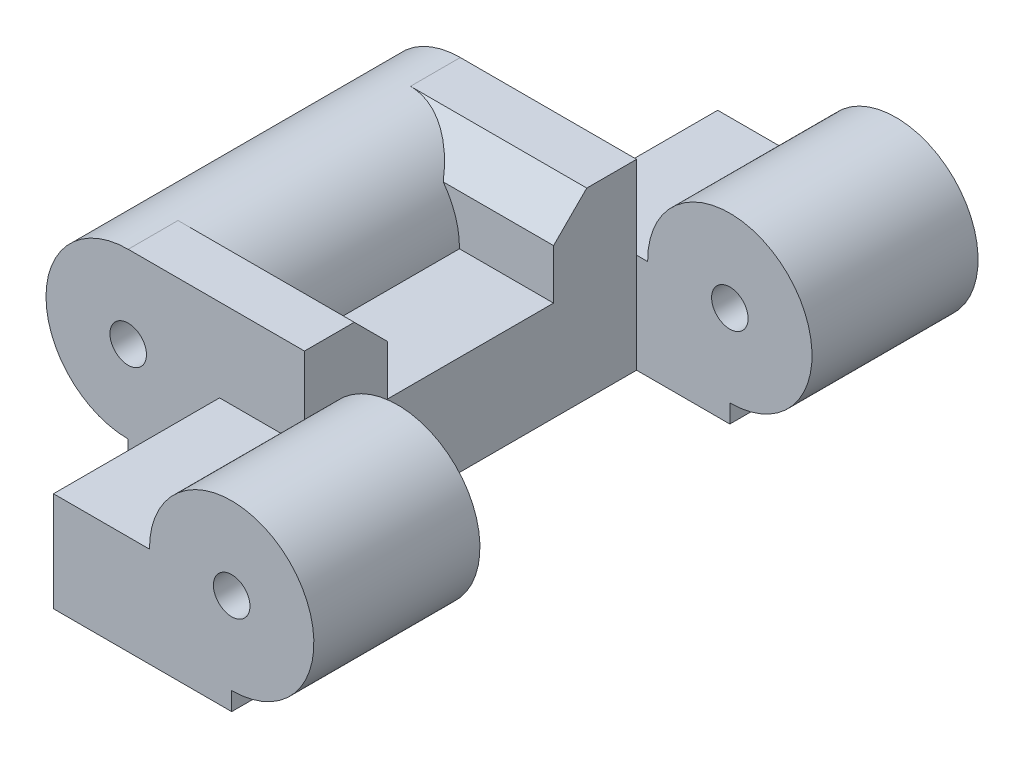
ISO-10303-21;
HEADER;
FILE_DESCRIPTION(('STEP AP214'),'2;1');
FILE_NAME('part.step','',(''),(''),'','','');
FILE_SCHEMA(('AUTOMOTIVE_DESIGN { 1 0 10303 214 1 1 1 1 }'));
ENDSEC;
DATA;
#1=APPLICATION_CONTEXT('core data for automotive mechanical design processes');
#2=APPLICATION_PROTOCOL_DEFINITION('international standard','automotive_design',2000,#1);
#3=PRODUCT_CONTEXT('',#1,'mechanical');
#4=PRODUCT('Part','Part','',(#3));
#5=PRODUCT_RELATED_PRODUCT_CATEGORY('part','',(#4));
#6=PRODUCT_DEFINITION_FORMATION('','',#4);
#7=PRODUCT_DEFINITION_CONTEXT('part definition',#1,'design');
#8=PRODUCT_DEFINITION('design','',#6,#7);
#9=PRODUCT_DEFINITION_SHAPE('','',#8);
#10=(LENGTH_UNIT() NAMED_UNIT(*) SI_UNIT(.MILLI.,.METRE.));
#11=(NAMED_UNIT(*) PLANE_ANGLE_UNIT() SI_UNIT($,.RADIAN.));
#12=(NAMED_UNIT(*) SI_UNIT($,.STERADIAN.) SOLID_ANGLE_UNIT());
#13=UNCERTAINTY_MEASURE_WITH_UNIT(LENGTH_MEASURE(1.E-05),#10,'distance_accuracy_value','');
#14=(GEOMETRIC_REPRESENTATION_CONTEXT(3) GLOBAL_UNCERTAINTY_ASSIGNED_CONTEXT((#13)) GLOBAL_UNIT_ASSIGNED_CONTEXT((#10,
#11,#12)) REPRESENTATION_CONTEXT('',''));
#15=CARTESIAN_POINT('',(0.,0.,0.));
#16=DIRECTION('',(0.,0.,1.));
#17=DIRECTION('',(1.,0.,0.));
#18=AXIS2_PLACEMENT_3D('',#15,#16,#17);
#19=CARTESIAN_POINT('',(0.,6.,20.));
#20=DIRECTION('',(0.,0.,-1.));
#21=DIRECTION('',(-1.,0.,0.));
#22=AXIS2_PLACEMENT_3D('',#19,#20,#21);
#23=PLANE('',#22);
#24=DIRECTION('',(0.,-1.,0.));
#25=VECTOR('',#24,1.);
#26=CARTESIAN_POINT('',(16.2325,6.,20.));
#27=LINE('',#26,#25);
#28=CARTESIAN_POINT('',(16.2325,1.1,20.));
#29=VERTEX_POINT('',#28);
#30=CARTESIAN_POINT('',(16.2325,0.,20.));
#31=VERTEX_POINT('',#30);
#32=EDGE_CURVE('E402',#29,#31,#27,.T.);
#33=ORIENTED_EDGE('',*,*,#32,.F.);
#34=CARTESIAN_POINT('',(16.2325,6.05,20.));
#35=DIRECTION('',(0.,0.,-1.));
#36=DIRECTION('',(-1.,0.,0.));
#37=AXIS2_PLACEMENT_3D('',#34,#35,#36);
#38=CIRCLE('',#37,4.95);
#39=CARTESIAN_POINT('',(11.2827525316942,6.,20.));
#40=VERTEX_POINT('',#39);
#41=EDGE_CURVE('E294',#29,#40,#38,.F.);
#42=ORIENTED_EDGE('',*,*,#41,.T.);
#43=DIRECTION('',(1.,0.,0.));
#44=VECTOR('',#43,1.);
#45=CARTESIAN_POINT('',(0.,6.,20.));
#46=LINE('',#45,#44);
#47=CARTESIAN_POINT('',(5.50050000000001,6.,20.));
#48=VERTEX_POINT('',#47);
#49=EDGE_CURVE('E399',#48,#40,#46,.T.);
#50=ORIENTED_EDGE('',*,*,#49,.F.);
#51=DIRECTION('',(0.,-1.,0.));
#52=VECTOR('',#51,1.);
#53=CARTESIAN_POINT('',(5.50050000000001,6.,20.));
#54=LINE('',#53,#52);
#55=CARTESIAN_POINT('',(5.50050000000001,0.,20.));
#56=VERTEX_POINT('',#55);
#57=EDGE_CURVE('E447',#48,#56,#54,.T.);
#58=ORIENTED_EDGE('',*,*,#57,.T.);
#59=DIRECTION('',(1.,0.,0.));
#60=VECTOR('',#59,1.);
#61=CARTESIAN_POINT('',(0.,0.,20.));
#62=LINE('',#61,#60);
#63=EDGE_CURVE('E383',#56,#31,#62,.T.);
#64=ORIENTED_EDGE('',*,*,#63,.T.);
#65=EDGE_LOOP('',(#33,#42,#50,#58,#64));
#66=FACE_BOUND('',#65,.T.);
#67=CARTESIAN_POINT('',(16.2325,6.05,20.));
#68=DIRECTION('',(0.,0.,1.));
#69=DIRECTION('',(1.,0.,0.));
#70=AXIS2_PLACEMENT_3D('',#67,#68,#69);
#71=CIRCLE('',#70,1.1);
#72=CARTESIAN_POINT('',(17.3325,6.05,20.));
#73=VERTEX_POINT('',#72);
#74=EDGE_CURVE('E276',#73,#73,#71,.T.);
#75=ORIENTED_EDGE('',*,*,#74,.F.);
#76=EDGE_LOOP('',(#75));
#77=FACE_BOUND('',#76,.T.);
#78=ADVANCED_FACE('F47',(#66,#77),#23,.F.);
#79=CARTESIAN_POINT('',(0.,6.,0.));
#80=DIRECTION('',(0.,1.,0.));
#81=DIRECTION('',(0.,0.,1.));
#82=AXIS2_PLACEMENT_3D('',#79,#80,#81);
#83=PLANE('',#82);
#84=DIRECTION('',(1.,0.,0.));
#85=VECTOR('',#84,1.);
#86=CARTESIAN_POINT('',(10.6165,6.,-5.));
#87=LINE('',#86,#85);
#88=CARTESIAN_POINT('',(4.94974746830584,6.,-5.));
#89=VERTEX_POINT('',#88);
#90=CARTESIAN_POINT('',(10.6165,6.,-5.));
#91=VERTEX_POINT('',#90);
#92=EDGE_CURVE('E357',#89,#91,#87,.T.);
#93=ORIENTED_EDGE('',*,*,#92,.F.);
#94=DIRECTION('',(0.,0.,-1.));
#95=VECTOR('',#94,1.);
#96=CARTESIAN_POINT('',(4.94974746830584,6.,24.0007142674936));
#97=LINE('',#96,#95);
#98=CARTESIAN_POINT('',(4.94974746830584,6.,5.));
#99=VERTEX_POINT('',#98);
#100=EDGE_CURVE('E315',#89,#99,#97,.F.);
#101=ORIENTED_EDGE('',*,*,#100,.T.);
#102=DIRECTION('',(-1.,0.,0.));
#103=VECTOR('',#102,1.);
#104=CARTESIAN_POINT('',(10.6165,6.,5.));
#105=LINE('',#104,#103);
#106=CARTESIAN_POINT('',(10.6165,6.,5.));
#107=VERTEX_POINT('',#106);
#108=EDGE_CURVE('E337',#107,#99,#105,.T.);
#109=ORIENTED_EDGE('',*,*,#108,.F.);
#110=DIRECTION('',(0.,0.,1.));
#111=VECTOR('',#110,1.);
#112=CARTESIAN_POINT('',(10.6165,6.,0.));
#113=LINE('',#112,#111);
#114=EDGE_CURVE('E382',#91,#107,#113,.T.);
#115=ORIENTED_EDGE('',*,*,#114,.F.);
#116=EDGE_LOOP('',(#93,#101,#109,#115));
#117=FACE_BOUND('',#116,.T.);
#118=ADVANCED_FACE('F524',(#117),#83,.T.);
#119=CARTESIAN_POINT('',(0.,6.,0.));
#120=DIRECTION('',(1.,0.,0.));
#121=DIRECTION('',(0.,0.,-1.));
#122=AXIS2_PLACEMENT_3D('',#119,#120,#121);
#123=PLANE('',#122);
#124=DIRECTION('',(0.,0.,-1.));
#125=VECTOR('',#124,1.);
#126=CARTESIAN_POINT('',(0.,1.1,24.0007142674936));
#127=LINE('',#126,#125);
#128=CARTESIAN_POINT('',(0.,1.1,-10.));
#129=VERTEX_POINT('',#128);
#130=CARTESIAN_POINT('',(0.,1.1,10.));
#131=VERTEX_POINT('',#130);
#132=EDGE_CURVE('E326',#129,#131,#127,.F.);
#133=ORIENTED_EDGE('',*,*,#132,.F.);
#134=DIRECTION('',(0.,-1.,0.));
#135=VECTOR('',#134,1.);
#136=CARTESIAN_POINT('',(0.,6.,-10.));
#137=LINE('',#136,#135);
#138=CARTESIAN_POINT('',(0.,0.,-10.));
#139=VERTEX_POINT('',#138);
#140=EDGE_CURVE('E457',#129,#139,#137,.T.);
#141=ORIENTED_EDGE('',*,*,#140,.T.);
#142=DIRECTION('',(0.,0.,1.));
#143=VECTOR('',#142,1.);
#144=CARTESIAN_POINT('',(0.,0.,0.));
#145=LINE('',#144,#143);
#146=CARTESIAN_POINT('',(0.,0.,10.));
#147=VERTEX_POINT('',#146);
#148=EDGE_CURVE('E431',#139,#147,#145,.T.);
#149=ORIENTED_EDGE('',*,*,#148,.T.);
#150=DIRECTION('',(0.,-1.,0.));
#151=VECTOR('',#150,1.);
#152=CARTESIAN_POINT('',(0.,6.,10.));
#153=LINE('',#152,#151);
#154=EDGE_CURVE('E454',#131,#147,#153,.T.);
#155=ORIENTED_EDGE('',*,*,#154,.F.);
#156=EDGE_LOOP('',(#133,#141,#149,#155));
#157=FACE_BOUND('',#156,.T.);
#158=ADVANCED_FACE('F506',(#157),#123,.F.);
#159=DIRECTION('',(0.,0.,-1.));
#160=VECTOR('',#159,1.);
#161=CARTESIAN_POINT('',(11.2827525316942,6.,34.0007142674936));
#162=LINE('',#161,#160);
#163=CARTESIAN_POINT('',(11.2827525316942,6.,10.));
#164=VERTEX_POINT('',#163);
#165=EDGE_CURVE('E301',#164,#40,#162,.F.);
#166=ORIENTED_EDGE('',*,*,#165,.F.);
#167=DIRECTION('',(1.,0.,0.));
#168=VECTOR('',#167,1.);
#169=CARTESIAN_POINT('',(0.,6.,9.99999999999999));
#170=LINE('',#169,#168);
#171=CARTESIAN_POINT('',(10.6165,6.,10.));
#172=VERTEX_POINT('',#171);
#173=EDGE_CURVE('E378',#172,#164,#170,.T.);
#174=ORIENTED_EDGE('',*,*,#173,.F.);
#175=DIRECTION('',(-1.,0.,0.));
#176=VECTOR('',#175,1.);
#177=CARTESIAN_POINT('',(0.,6.,10.));
#178=LINE('',#177,#176);
#179=CARTESIAN_POINT('',(5.5005,6.,10.));
#180=VERTEX_POINT('',#179);
#181=EDGE_CURVE('E243',#172,#180,#178,.T.);
#182=ORIENTED_EDGE('',*,*,#181,.T.);
#183=DIRECTION('',(0.,0.,1.));
#184=VECTOR('',#183,1.);
#185=CARTESIAN_POINT('',(5.5005,6.,0.));
#186=LINE('',#185,#184);
#187=EDGE_CURVE('E396',#180,#48,#186,.T.);
#188=ORIENTED_EDGE('',*,*,#187,.T.);
#189=ORIENTED_EDGE('',*,*,#49,.T.);
#190=EDGE_LOOP('',(#166,#174,#182,#188,#189));
#191=FACE_BOUND('',#190,.T.);
#192=ADVANCED_FACE('F537',(#191),#83,.T.);
#193=DIRECTION('',(0.,0.,-1.));
#194=VECTOR('',#193,1.);
#195=CARTESIAN_POINT('',(11.2827525316942,6.,4.00071426749364));
#196=LINE('',#195,#194);
#197=CARTESIAN_POINT('',(11.2827525316942,6.,-20.));
#198=VERTEX_POINT('',#197);
#199=CARTESIAN_POINT('',(11.2827525316942,6.,-10.));
#200=VERTEX_POINT('',#199);
#201=EDGE_CURVE('E207',#198,#200,#196,.F.);
#202=ORIENTED_EDGE('',*,*,#201,.F.);
#203=DIRECTION('',(1.,0.,0.));
#204=VECTOR('',#203,1.);
#205=CARTESIAN_POINT('',(0.,6.,-20.));
#206=LINE('',#205,#204);
#207=CARTESIAN_POINT('',(5.50049999999999,6.,-20.));
#208=VERTEX_POINT('',#207);
#209=EDGE_CURVE('E216',#208,#198,#206,.T.);
#210=ORIENTED_EDGE('',*,*,#209,.F.);
#211=DIRECTION('',(0.,0.,-1.));
#212=VECTOR('',#211,1.);
#213=CARTESIAN_POINT('',(5.5005,6.,0.));
#214=LINE('',#213,#212);
#215=CARTESIAN_POINT('',(5.5005,6.,-10.));
#216=VERTEX_POINT('',#215);
#217=EDGE_CURVE('E392',#216,#208,#214,.T.);
#218=ORIENTED_EDGE('',*,*,#217,.F.);
#219=DIRECTION('',(-1.,0.,0.));
#220=VECTOR('',#219,1.);
#221=CARTESIAN_POINT('',(10.6165,6.,-10.));
#222=LINE('',#221,#220);
#223=CARTESIAN_POINT('',(10.6165,6.,-10.));
#224=VERTEX_POINT('',#223);
#225=EDGE_CURVE('E341',#224,#216,#222,.T.);
#226=ORIENTED_EDGE('',*,*,#225,.F.);
#227=DIRECTION('',(-1.,0.,0.));
#228=VECTOR('',#227,1.);
#229=CARTESIAN_POINT('',(0.,6.,-10.));
#230=LINE('',#229,#228);
#231=EDGE_CURVE('E387',#200,#224,#230,.T.);
#232=ORIENTED_EDGE('',*,*,#231,.F.);
#233=EDGE_LOOP('',(#202,#210,#218,#226,#232));
#234=FACE_BOUND('',#233,.T.);
#235=ADVANCED_FACE('F558',(#234),#83,.T.);
#236=CARTESIAN_POINT('',(16.2325,6.,0.));
#237=DIRECTION('',(1.,0.,0.));
#238=DIRECTION('',(0.,0.,-1.));
#239=AXIS2_PLACEMENT_3D('',#236,#237,#238);
#240=PLANE('',#239);
#241=DIRECTION('',(0.,0.,-1.));
#242=VECTOR('',#241,1.);
#243=CARTESIAN_POINT('',(16.2325,1.1,34.0007142674936));
#244=LINE('',#243,#242);
#245=CARTESIAN_POINT('',(16.2325,1.1,10.));
#246=VERTEX_POINT('',#245);
#247=EDGE_CURVE('E298',#29,#246,#244,.T.);
#248=ORIENTED_EDGE('',*,*,#247,.F.);
#249=ORIENTED_EDGE('',*,*,#32,.T.);
#250=DIRECTION('',(0.,0.,1.));
#251=VECTOR('',#250,1.);
#252=CARTESIAN_POINT('',(16.2325,0.,0.));
#253=LINE('',#252,#251);
#254=CARTESIAN_POINT('',(16.2325,0.,10.));
#255=VERTEX_POINT('',#254);
#256=EDGE_CURVE('E377',#255,#31,#253,.T.);
#257=ORIENTED_EDGE('',*,*,#256,.F.);
#258=DIRECTION('',(0.,-1.,0.));
#259=VECTOR('',#258,1.);
#260=CARTESIAN_POINT('',(16.2325,6.,10.));
#261=LINE('',#260,#259);
#262=EDGE_CURVE('E74',#246,#255,#261,.T.);
#263=ORIENTED_EDGE('',*,*,#262,.F.);
#264=EDGE_LOOP('',(#248,#249,#257,#263));
#265=FACE_BOUND('',#264,.T.);
#266=ADVANCED_FACE('F489',(#265),#240,.T.);
#267=CARTESIAN_POINT('',(0.,6.,9.99999999999999));
#268=DIRECTION('',(0.,0.,-1.));
#269=DIRECTION('',(-1.,0.,0.));
#270=AXIS2_PLACEMENT_3D('',#267,#268,#269);
#271=PLANE('',#270);
#272=CARTESIAN_POINT('',(16.2325,6.05,10.));
#273=DIRECTION('',(0.,0.,-1.));
#274=DIRECTION('',(-1.,0.,0.));
#275=AXIS2_PLACEMENT_3D('',#272,#273,#274);
#276=CIRCLE('',#275,1.09999999999999);
#277=CARTESIAN_POINT('',(15.1325,6.05,10.));
#278=VERTEX_POINT('',#277);
#279=EDGE_CURVE('E218',#278,#278,#276,.T.);
#280=ORIENTED_EDGE('',*,*,#279,.F.);
#281=EDGE_LOOP('',(#280));
#282=FACE_BOUND('',#281,.T.);
#283=ORIENTED_EDGE('',*,*,#173,.T.);
#284=CARTESIAN_POINT('',(16.2325,6.05,10.));
#285=DIRECTION('',(0.,0.,-1.));
#286=DIRECTION('',(-1.,0.,0.));
#287=AXIS2_PLACEMENT_3D('',#284,#285,#286);
#288=CIRCLE('',#287,4.95);
#289=EDGE_CURVE('E290',#164,#246,#288,.T.);
#290=ORIENTED_EDGE('',*,*,#289,.T.);
#291=ORIENTED_EDGE('',*,*,#262,.T.);
#292=DIRECTION('',(1.,0.,0.));
#293=VECTOR('',#292,1.);
#294=CARTESIAN_POINT('',(0.,0.,9.99999999999999));
#295=LINE('',#294,#293);
#296=CARTESIAN_POINT('',(10.6165,0.,10.));
#297=VERTEX_POINT('',#296);
#298=EDGE_CURVE('E406',#297,#255,#295,.T.);
#299=ORIENTED_EDGE('',*,*,#298,.F.);
#300=DIRECTION('',(0.,-1.,0.));
#301=VECTOR('',#300,1.);
#302=CARTESIAN_POINT('',(10.6165,6.,10.));
#303=LINE('',#302,#301);
#304=EDGE_CURVE('E238',#172,#297,#303,.T.);
#305=ORIENTED_EDGE('',*,*,#304,.F.);
#306=EDGE_LOOP('',(#283,#290,#291,#299,#305));
#307=FACE_BOUND('',#306,.T.);
#308=ADVANCED_FACE('F486',(#282,#307),#271,.T.);
#309=CARTESIAN_POINT('',(10.6165,6.,0.));
#310=DIRECTION('',(1.,0.,0.));
#311=DIRECTION('',(0.,0.,-1.));
#312=AXIS2_PLACEMENT_3D('',#309,#310,#311);
#313=PLANE('',#312);
#314=DIRECTION('',(0.,0.,-1.));
#315=VECTOR('',#314,1.);
#316=CARTESIAN_POINT('',(10.6165,11.,-10.));
#317=LINE('',#316,#315);
#318=CARTESIAN_POINT('',(10.6165,11.,-7.00000000000001));
#319=VERTEX_POINT('',#318);
#320=CARTESIAN_POINT('',(10.6165,11.,-10.));
#321=VERTEX_POINT('',#320);
#322=EDGE_CURVE('E361',#319,#321,#317,.T.);
#323=ORIENTED_EDGE('',*,*,#322,.F.);
#324=DIRECTION('',(0.,-0.707106781186548,0.707106781186548));
#325=VECTOR('',#324,1.);
#326=CARTESIAN_POINT('',(10.6165,5.,-1.));
#327=LINE('',#326,#325);
#328=CARTESIAN_POINT('',(10.6165,8.99999999999999,-5.));
#329=VERTEX_POINT('',#328);
#330=EDGE_CURVE('E253',#319,#329,#327,.T.);
#331=ORIENTED_EDGE('',*,*,#330,.T.);
#332=DIRECTION('',(0.,-1.,0.));
#333=VECTOR('',#332,1.);
#334=CARTESIAN_POINT('',(10.6165,11.,-5.));
#335=LINE('',#334,#333);
#336=EDGE_CURVE('E373',#329,#91,#335,.T.);
#337=ORIENTED_EDGE('',*,*,#336,.T.);
#338=ORIENTED_EDGE('',*,*,#114,.T.);
#339=DIRECTION('',(0.,-1.,0.));
#340=VECTOR('',#339,1.);
#341=CARTESIAN_POINT('',(10.6165,11.,5.));
#342=LINE('',#341,#340);
#343=CARTESIAN_POINT('',(10.6165,8.99999999999999,5.));
#344=VERTEX_POINT('',#343);
#345=EDGE_CURVE('E329',#344,#107,#342,.T.);
#346=ORIENTED_EDGE('',*,*,#345,.F.);
#347=DIRECTION('',(0.,-0.707106781186548,-0.707106781186548));
#348=VECTOR('',#347,1.);
#349=CARTESIAN_POINT('',(10.6165,5.,1.));
#350=LINE('',#349,#348);
#351=CARTESIAN_POINT('',(10.6165,11.,7.00000000000001));
#352=VERTEX_POINT('',#351);
#353=EDGE_CURVE('E250',#344,#352,#350,.F.);
#354=ORIENTED_EDGE('',*,*,#353,.T.);
#355=DIRECTION('',(0.,0.,-1.));
#356=VECTOR('',#355,1.);
#357=CARTESIAN_POINT('',(10.6165,11.,5.));
#358=LINE('',#357,#356);
#359=CARTESIAN_POINT('',(10.6165,11.,10.));
#360=VERTEX_POINT('',#359);
#361=EDGE_CURVE('E342',#360,#352,#358,.T.);
#362=ORIENTED_EDGE('',*,*,#361,.F.);
#363=DIRECTION('',(0.,-1.,0.));
#364=VECTOR('',#363,1.);
#365=CARTESIAN_POINT('',(10.6165,11.,10.));
#366=LINE('',#365,#364);
#367=EDGE_CURVE('E332',#360,#172,#366,.T.);
#368=ORIENTED_EDGE('',*,*,#367,.T.);
#369=ORIENTED_EDGE('',*,*,#304,.T.);
#370=DIRECTION('',(0.,0.,1.));
#371=VECTOR('',#370,1.);
#372=CARTESIAN_POINT('',(10.6165,0.,0.));
#373=LINE('',#372,#371);
#374=CARTESIAN_POINT('',(10.6165,0.,-10.));
#375=VERTEX_POINT('',#374);
#376=EDGE_CURVE('E410',#375,#297,#373,.T.);
#377=ORIENTED_EDGE('',*,*,#376,.F.);
#378=DIRECTION('',(0.,-1.,0.));
#379=VECTOR('',#378,1.);
#380=CARTESIAN_POINT('',(10.6165,6.,-10.));
#381=LINE('',#380,#379);
#382=EDGE_CURVE('E230',#224,#375,#381,.T.);
#383=ORIENTED_EDGE('',*,*,#382,.F.);
#384=DIRECTION('',(0.,-1.,0.));
#385=VECTOR('',#384,1.);
#386=CARTESIAN_POINT('',(10.6165,11.,-10.));
#387=LINE('',#386,#385);
#388=EDGE_CURVE('E364',#321,#224,#387,.T.);
#389=ORIENTED_EDGE('',*,*,#388,.F.);
#390=EDGE_LOOP('',(#323,#331,#337,#338,#346,#354,#362,#368,#369,#377,#383,#389));
#391=FACE_BOUND('',#390,.T.);
#392=ADVANCED_FACE('F481',(#391),#313,.T.);
#393=CARTESIAN_POINT('',(0.,6.,-10.));
#394=DIRECTION('',(0.,0.,1.));
#395=DIRECTION('',(1.,0.,0.));
#396=AXIS2_PLACEMENT_3D('',#393,#394,#395);
#397=PLANE('',#396);
#398=CARTESIAN_POINT('',(16.2325,6.05,-9.99999999999999));
#399=DIRECTION('',(0.,0.,1.));
#400=DIRECTION('',(1.,0.,0.));
#401=AXIS2_PLACEMENT_3D('',#398,#399,#400);
#402=CIRCLE('',#401,1.09999999999999);
#403=CARTESIAN_POINT('',(17.3325,6.05,-9.99999999999999));
#404=VERTEX_POINT('',#403);
#405=EDGE_CURVE('E265',#404,#404,#402,.T.);
#406=ORIENTED_EDGE('',*,*,#405,.F.);
#407=EDGE_LOOP('',(#406));
#408=FACE_BOUND('',#407,.T.);
#409=CARTESIAN_POINT('',(16.2325,6.05,-10.));
#410=DIRECTION('',(0.,0.,1.));
#411=DIRECTION('',(1.,0.,0.));
#412=AXIS2_PLACEMENT_3D('',#409,#410,#411);
#413=CIRCLE('',#412,4.95);
#414=CARTESIAN_POINT('',(16.2325,1.1,-10.));
#415=VERTEX_POINT('',#414);
#416=EDGE_CURVE('E66',#200,#415,#413,.F.);
#417=ORIENTED_EDGE('',*,*,#416,.F.);
#418=ORIENTED_EDGE('',*,*,#231,.T.);
#419=ORIENTED_EDGE('',*,*,#382,.T.);
#420=DIRECTION('',(-1.,0.,0.));
#421=VECTOR('',#420,1.);
#422=CARTESIAN_POINT('',(0.,0.,-10.));
#423=LINE('',#422,#421);
#424=CARTESIAN_POINT('',(16.2325,0.,-10.));
#425=VERTEX_POINT('',#424);
#426=EDGE_CURVE('E414',#425,#375,#423,.T.);
#427=ORIENTED_EDGE('',*,*,#426,.F.);
#428=DIRECTION('',(0.,-1.,0.));
#429=VECTOR('',#428,1.);
#430=CARTESIAN_POINT('',(16.2325,6.,-10.));
#431=LINE('',#430,#429);
#432=EDGE_CURVE('E225',#415,#425,#431,.T.);
#433=ORIENTED_EDGE('',*,*,#432,.F.);
#434=EDGE_LOOP('',(#417,#418,#419,#427,#433));
#435=FACE_BOUND('',#434,.T.);
#436=ADVANCED_FACE('F474',(#408,#435),#397,.T.);
#437=CARTESIAN_POINT('',(16.2325,6.,0.));
#438=DIRECTION('',(-1.,0.,0.));
#439=DIRECTION('',(0.,0.,1.));
#440=AXIS2_PLACEMENT_3D('',#437,#438,#439);
#441=PLANE('',#440);
#442=DIRECTION('',(0.,-1.,0.));
#443=VECTOR('',#442,1.);
#444=CARTESIAN_POINT('',(16.2325,6.,-20.));
#445=LINE('',#444,#443);
#446=CARTESIAN_POINT('',(16.2325,1.1,-20.));
#447=VERTEX_POINT('',#446);
#448=CARTESIAN_POINT('',(16.2325,0.,-20.));
#449=VERTEX_POINT('',#448);
#450=EDGE_CURVE('E213',#447,#449,#445,.T.);
#451=ORIENTED_EDGE('',*,*,#450,.F.);
#452=DIRECTION('',(0.,0.,-1.));
#453=VECTOR('',#452,1.);
#454=CARTESIAN_POINT('',(16.2325,1.1,4.00071426749364));
#455=LINE('',#454,#453);
#456=EDGE_CURVE('E198',#447,#415,#455,.F.);
#457=ORIENTED_EDGE('',*,*,#456,.T.);
#458=ORIENTED_EDGE('',*,*,#432,.T.);
#459=DIRECTION('',(0.,0.,-1.));
#460=VECTOR('',#459,1.);
#461=CARTESIAN_POINT('',(16.2325,0.,0.));
#462=LINE('',#461,#460);
#463=EDGE_CURVE('E222',#425,#449,#462,.T.);
#464=ORIENTED_EDGE('',*,*,#463,.T.);
#465=EDGE_LOOP('',(#451,#457,#458,#464));
#466=FACE_BOUND('',#465,.T.);
#467=ADVANCED_FACE('F220',(#466),#441,.F.);
#468=CARTESIAN_POINT('',(0.,6.,-20.));
#469=DIRECTION('',(0.,0.,-1.));
#470=DIRECTION('',(-1.,0.,0.));
#471=AXIS2_PLACEMENT_3D('',#468,#469,#470);
#472=PLANE('',#471);
#473=CARTESIAN_POINT('',(16.2325,6.05,-20.));
#474=DIRECTION('',(0.,0.,1.));
#475=DIRECTION('',(1.,0.,0.));
#476=AXIS2_PLACEMENT_3D('',#473,#474,#475);
#477=CIRCLE('',#476,1.09999999999999);
#478=CARTESIAN_POINT('',(17.3325,6.05,-20.));
#479=VERTEX_POINT('',#478);
#480=EDGE_CURVE('E268',#479,#479,#477,.T.);
#481=ORIENTED_EDGE('',*,*,#480,.T.);
#482=EDGE_LOOP('',(#481));
#483=FACE_BOUND('',#482,.T.);
#484=ORIENTED_EDGE('',*,*,#209,.T.);
#485=CARTESIAN_POINT('',(16.2325,6.05,-20.));
#486=DIRECTION('',(0.,0.,-1.));
#487=DIRECTION('',(-1.,0.,0.));
#488=AXIS2_PLACEMENT_3D('',#485,#486,#487);
#489=CIRCLE('',#488,4.95);
#490=EDGE_CURVE('E201',#198,#447,#489,.T.);
#491=ORIENTED_EDGE('',*,*,#490,.T.);
#492=ORIENTED_EDGE('',*,*,#450,.T.);
#493=DIRECTION('',(1.,0.,0.));
#494=VECTOR('',#493,1.);
#495=CARTESIAN_POINT('',(0.,0.,-20.));
#496=LINE('',#495,#494);
#497=CARTESIAN_POINT('',(5.50049999999999,0.,-20.));
#498=VERTEX_POINT('',#497);
#499=EDGE_CURVE('E420',#498,#449,#496,.T.);
#500=ORIENTED_EDGE('',*,*,#499,.F.);
#501=DIRECTION('',(0.,-1.,0.));
#502=VECTOR('',#501,1.);
#503=CARTESIAN_POINT('',(5.50049999999999,6.,-20.));
#504=LINE('',#503,#502);
#505=EDGE_CURVE('E226',#208,#498,#504,.T.);
#506=ORIENTED_EDGE('',*,*,#505,.F.);
#507=EDGE_LOOP('',(#484,#491,#492,#500,#506));
#508=FACE_BOUND('',#507,.T.);
#509=ADVANCED_FACE('F211',(#483,#508),#472,.T.);
#510=CARTESIAN_POINT('',(5.5005,6.,0.));
#511=DIRECTION('',(-1.,0.,0.));
#512=DIRECTION('',(0.,0.,1.));
#513=AXIS2_PLACEMENT_3D('',#510,#511,#512);
#514=PLANE('',#513);
#515=DIRECTION('',(0.,0.,-1.));
#516=VECTOR('',#515,1.);
#517=CARTESIAN_POINT('',(5.5005,0.,0.));
#518=LINE('',#517,#516);
#519=CARTESIAN_POINT('',(5.5005,0.,-10.));
#520=VERTEX_POINT('',#519);
#521=EDGE_CURVE('E423',#520,#498,#518,.T.);
#522=ORIENTED_EDGE('',*,*,#521,.F.);
#523=DIRECTION('',(0.,-1.,0.));
#524=VECTOR('',#523,1.);
#525=CARTESIAN_POINT('',(5.5005,6.,-10.));
#526=LINE('',#525,#524);
#527=EDGE_CURVE('E232',#216,#520,#526,.T.);
#528=ORIENTED_EDGE('',*,*,#527,.F.);
#529=ORIENTED_EDGE('',*,*,#217,.T.);
#530=ORIENTED_EDGE('',*,*,#505,.T.);
#531=EDGE_LOOP('',(#522,#528,#529,#530));
#532=FACE_BOUND('',#531,.T.);
#533=ADVANCED_FACE('F471',(#532),#514,.T.);
#534=CARTESIAN_POINT('',(0.,6.,-10.));
#535=DIRECTION('',(0.,0.,1.));
#536=DIRECTION('',(1.,0.,0.));
#537=AXIS2_PLACEMENT_3D('',#534,#535,#536);
#538=PLANE('',#537);
#539=CARTESIAN_POINT('',(0.,6.05,-10.));
#540=DIRECTION('',(0.,0.,1.));
#541=DIRECTION('',(1.,0.,0.));
#542=AXIS2_PLACEMENT_3D('',#539,#540,#541);
#543=CIRCLE('',#542,1.09999999999999);
#544=CARTESIAN_POINT('',(1.1,6.05,-10.));
#545=VERTEX_POINT('',#544);
#546=EDGE_CURVE('E282',#545,#545,#543,.T.);
#547=ORIENTED_EDGE('',*,*,#546,.T.);
#548=EDGE_LOOP('',(#547));
#549=FACE_BOUND('',#548,.T.);
#550=ORIENTED_EDGE('',*,*,#140,.F.);
#551=CARTESIAN_POINT('',(0.,6.05,-10.));
#552=DIRECTION('',(0.,0.,1.));
#553=DIRECTION('',(1.,0.,0.));
#554=AXIS2_PLACEMENT_3D('',#551,#552,#553);
#555=CIRCLE('',#554,4.95);
#556=CARTESIAN_POINT('',(0.,11.,-10.));
#557=VERTEX_POINT('',#556);
#558=EDGE_CURVE('E305',#557,#129,#555,.T.);
#559=ORIENTED_EDGE('',*,*,#558,.F.);
#560=DIRECTION('',(-1.,0.,0.));
#561=VECTOR('',#560,1.);
#562=CARTESIAN_POINT('',(10.6165,11.,-10.));
#563=LINE('',#562,#561);
#564=EDGE_CURVE('E352',#321,#557,#563,.T.);
#565=ORIENTED_EDGE('',*,*,#564,.F.);
#566=ORIENTED_EDGE('',*,*,#388,.T.);
#567=ORIENTED_EDGE('',*,*,#225,.T.);
#568=ORIENTED_EDGE('',*,*,#527,.T.);
#569=DIRECTION('',(-1.,0.,0.));
#570=VECTOR('',#569,1.);
#571=CARTESIAN_POINT('',(0.,0.,-10.));
#572=LINE('',#571,#570);
#573=EDGE_CURVE('E427',#520,#139,#572,.T.);
#574=ORIENTED_EDGE('',*,*,#573,.T.);
#575=EDGE_LOOP('',(#550,#559,#565,#566,#567,#568,#574));
#576=FACE_BOUND('',#575,.T.);
#577=ADVANCED_FACE('F463',(#549,#576),#538,.F.);
#578=CARTESIAN_POINT('',(0.,6.,10.));
#579=DIRECTION('',(0.,0.,1.));
#580=DIRECTION('',(1.,0.,0.));
#581=AXIS2_PLACEMENT_3D('',#578,#579,#580);
#582=PLANE('',#581);
#583=CARTESIAN_POINT('',(0.,6.05,10.));
#584=DIRECTION('',(0.,0.,1.));
#585=DIRECTION('',(1.,0.,0.));
#586=AXIS2_PLACEMENT_3D('',#583,#584,#585);
#587=CIRCLE('',#586,1.09999999999999);
#588=CARTESIAN_POINT('',(1.1,6.05,10.));
#589=VERTEX_POINT('',#588);
#590=EDGE_CURVE('E52',#589,#589,#587,.T.);
#591=ORIENTED_EDGE('',*,*,#590,.F.);
#592=EDGE_LOOP('',(#591));
#593=FACE_BOUND('',#592,.T.);
#594=DIRECTION('',(1.,0.,0.));
#595=VECTOR('',#594,1.);
#596=CARTESIAN_POINT('',(10.6165,11.,10.));
#597=LINE('',#596,#595);
#598=CARTESIAN_POINT('',(0.,11.,10.));
#599=VERTEX_POINT('',#598);
#600=EDGE_CURVE('E336',#599,#360,#597,.T.);
#601=ORIENTED_EDGE('',*,*,#600,.F.);
#602=CARTESIAN_POINT('',(0.,6.05,10.));
#603=DIRECTION('',(0.,0.,1.));
#604=DIRECTION('',(1.,0.,0.));
#605=AXIS2_PLACEMENT_3D('',#602,#603,#604);
#606=CIRCLE('',#605,4.95);
#607=EDGE_CURVE('E308',#599,#131,#606,.T.);
#608=ORIENTED_EDGE('',*,*,#607,.T.);
#609=ORIENTED_EDGE('',*,*,#154,.T.);
#610=DIRECTION('',(-1.,0.,0.));
#611=VECTOR('',#610,1.);
#612=CARTESIAN_POINT('',(0.,0.,10.));
#613=LINE('',#612,#611);
#614=CARTESIAN_POINT('',(5.5005,0.,10.));
#615=VERTEX_POINT('',#614);
#616=EDGE_CURVE('E435',#615,#147,#613,.T.);
#617=ORIENTED_EDGE('',*,*,#616,.F.);
#618=DIRECTION('',(0.,-1.,0.));
#619=VECTOR('',#618,1.);
#620=CARTESIAN_POINT('',(5.5005,6.,10.));
#621=LINE('',#620,#619);
#622=EDGE_CURVE('E451',#180,#615,#621,.T.);
#623=ORIENTED_EDGE('',*,*,#622,.F.);
#624=ORIENTED_EDGE('',*,*,#181,.F.);
#625=ORIENTED_EDGE('',*,*,#367,.F.);
#626=EDGE_LOOP('',(#601,#608,#609,#617,#623,#624,#625));
#627=FACE_BOUND('',#626,.T.);
#628=ADVANCED_FACE('F501',(#593,#627),#582,.T.);
#629=CARTESIAN_POINT('',(5.5005,6.,0.));
#630=DIRECTION('',(1.,0.,0.));
#631=DIRECTION('',(0.,0.,-1.));
#632=AXIS2_PLACEMENT_3D('',#629,#630,#631);
#633=PLANE('',#632);
#634=DIRECTION('',(0.,0.,1.));
#635=VECTOR('',#634,1.);
#636=CARTESIAN_POINT('',(5.5005,0.,0.));
#637=LINE('',#636,#635);
#638=EDGE_CURVE('E439',#615,#56,#637,.T.);
#639=ORIENTED_EDGE('',*,*,#638,.T.);
#640=ORIENTED_EDGE('',*,*,#57,.F.);
#641=ORIENTED_EDGE('',*,*,#187,.F.);
#642=ORIENTED_EDGE('',*,*,#622,.T.);
#643=EDGE_LOOP('',(#639,#640,#641,#642));
#644=FACE_BOUND('',#643,.T.);
#645=ADVANCED_FACE('F561',(#644),#633,.F.);
#646=CARTESIAN_POINT('',(0.,0.,0.));
#647=DIRECTION('',(0.,1.,0.));
#648=DIRECTION('',(0.,0.,1.));
#649=AXIS2_PLACEMENT_3D('',#646,#647,#648);
#650=PLANE('',#649);
#651=ORIENTED_EDGE('',*,*,#256,.T.);
#652=ORIENTED_EDGE('',*,*,#63,.F.);
#653=ORIENTED_EDGE('',*,*,#638,.F.);
#654=ORIENTED_EDGE('',*,*,#616,.T.);
#655=ORIENTED_EDGE('',*,*,#148,.F.);
#656=ORIENTED_EDGE('',*,*,#573,.F.);
#657=ORIENTED_EDGE('',*,*,#521,.T.);
#658=ORIENTED_EDGE('',*,*,#499,.T.);
#659=ORIENTED_EDGE('',*,*,#463,.F.);
#660=ORIENTED_EDGE('',*,*,#426,.T.);
#661=ORIENTED_EDGE('',*,*,#376,.T.);
#662=ORIENTED_EDGE('',*,*,#298,.T.);
#663=EDGE_LOOP('',(#651,#652,#653,#654,#655,#656,#657,#658,#659,#660,#661,#662));
#664=FACE_BOUND('',#663,.T.);
#665=ADVANCED_FACE('F470',(#664),#650,.F.);
#666=CARTESIAN_POINT('',(10.6165,11.,-5.));
#667=DIRECTION('',(0.,0.,-1.));
#668=DIRECTION('',(-1.,0.,0.));
#669=AXIS2_PLACEMENT_3D('',#666,#667,#668);
#670=PLANE('',#669);
#671=CARTESIAN_POINT('',(0.,6.05,-5.));
#672=DIRECTION('',(0.,0.,-1.));
#673=DIRECTION('',(-1.,0.,0.));
#674=AXIS2_PLACEMENT_3D('',#671,#672,#673);
#675=CIRCLE('',#674,4.95);
#676=CARTESIAN_POINT('',(3.97492138287037,8.99999999999999,-5.));
#677=VERTEX_POINT('',#676);
#678=EDGE_CURVE('E319',#89,#677,#675,.F.);
#679=ORIENTED_EDGE('',*,*,#678,.F.);
#680=ORIENTED_EDGE('',*,*,#92,.T.);
#681=ORIENTED_EDGE('',*,*,#336,.F.);
#682=DIRECTION('',(-1.,0.,0.));
#683=VECTOR('',#682,1.);
#684=CARTESIAN_POINT('',(0.,8.99999999999999,-5.));
#685=LINE('',#684,#683);
#686=EDGE_CURVE('E256',#329,#677,#685,.T.);
#687=ORIENTED_EDGE('',*,*,#686,.T.);
#688=EDGE_LOOP('',(#679,#680,#681,#687));
#689=FACE_BOUND('',#688,.T.);
#690=ADVANCED_FACE('F519',(#689),#670,.F.);
#691=CARTESIAN_POINT('',(0.,11.,0.));
#692=DIRECTION('',(0.,1.,0.));
#693=DIRECTION('',(0.,0.,1.));
#694=AXIS2_PLACEMENT_3D('',#691,#692,#693);
#695=PLANE('',#694);
#696=DIRECTION('',(0.,0.,1.));
#697=VECTOR('',#696,1.);
#698=CARTESIAN_POINT('',(0.,11.,-10.));
#699=LINE('',#698,#697);
#700=CARTESIAN_POINT('',(0.,11.,-7.00000000000001));
#701=VERTEX_POINT('',#700);
#702=EDGE_CURVE('E356',#557,#701,#699,.T.);
#703=ORIENTED_EDGE('',*,*,#702,.T.);
#704=DIRECTION('',(1.,0.,0.));
#705=VECTOR('',#704,1.);
#706=CARTESIAN_POINT('',(10.6165,11.,-7.00000000000001));
#707=LINE('',#706,#705);
#708=EDGE_CURVE('E246',#701,#319,#707,.T.);
#709=ORIENTED_EDGE('',*,*,#708,.T.);
#710=ORIENTED_EDGE('',*,*,#322,.T.);
#711=ORIENTED_EDGE('',*,*,#564,.T.);
#712=EDGE_LOOP('',(#703,#709,#710,#711));
#713=FACE_BOUND('',#712,.T.);
#714=ADVANCED_FACE('F511',(#713),#695,.T.);
#715=CARTESIAN_POINT('',(10.6165,11.,5.));
#716=DIRECTION('',(0.,0.,1.));
#717=DIRECTION('',(1.,0.,0.));
#718=AXIS2_PLACEMENT_3D('',#715,#716,#717);
#719=PLANE('',#718);
#720=CARTESIAN_POINT('',(0.,6.05,5.));
#721=DIRECTION('',(0.,0.,1.));
#722=DIRECTION('',(1.,0.,0.));
#723=AXIS2_PLACEMENT_3D('',#720,#721,#722);
#724=CIRCLE('',#723,4.95);
#725=CARTESIAN_POINT('',(3.97492138287037,8.99999999999999,5.));
#726=VERTEX_POINT('',#725);
#727=EDGE_CURVE('E312',#726,#99,#724,.F.);
#728=ORIENTED_EDGE('',*,*,#727,.F.);
#729=DIRECTION('',(1.,0.,0.));
#730=VECTOR('',#729,1.);
#731=CARTESIAN_POINT('',(10.6165,8.99999999999999,5.));
#732=LINE('',#731,#730);
#733=EDGE_CURVE('E58',#726,#344,#732,.T.);
#734=ORIENTED_EDGE('',*,*,#733,.T.);
#735=ORIENTED_EDGE('',*,*,#345,.T.);
#736=ORIENTED_EDGE('',*,*,#108,.T.);
#737=EDGE_LOOP('',(#728,#734,#735,#736));
#738=FACE_BOUND('',#737,.T.);
#739=ADVANCED_FACE('F593',(#738),#719,.F.);
#740=CARTESIAN_POINT('',(0.,11.,0.));
#741=DIRECTION('',(0.,-1.,0.));
#742=DIRECTION('',(0.,0.,-1.));
#743=AXIS2_PLACEMENT_3D('',#740,#741,#742);
#744=PLANE('',#743);
#745=ORIENTED_EDGE('',*,*,#361,.T.);
#746=DIRECTION('',(-1.,0.,0.));
#747=VECTOR('',#746,1.);
#748=CARTESIAN_POINT('',(0.,11.,7.00000000000001));
#749=LINE('',#748,#747);
#750=CARTESIAN_POINT('',(0.,11.,7.00000000000001));
#751=VERTEX_POINT('',#750);
#752=EDGE_CURVE('E260',#352,#751,#749,.T.);
#753=ORIENTED_EDGE('',*,*,#752,.T.);
#754=DIRECTION('',(0.,0.,1.));
#755=VECTOR('',#754,1.);
#756=CARTESIAN_POINT('',(0.,11.,5.));
#757=LINE('',#756,#755);
#758=EDGE_CURVE('E345',#751,#599,#757,.T.);
#759=ORIENTED_EDGE('',*,*,#758,.T.);
#760=ORIENTED_EDGE('',*,*,#600,.T.);
#761=EDGE_LOOP('',(#745,#753,#759,#760));
#762=FACE_BOUND('',#761,.T.);
#763=ADVANCED_FACE('F534',(#762),#744,.F.);
#764=CARTESIAN_POINT('',(0.,11.,-7.00000000000001));
#765=DIRECTION('',(0.,0.707106781186548,0.707106781186548));
#766=DIRECTION('',(-1.,0.,0.));
#767=AXIS2_PLACEMENT_3D('',#764,#765,#766);
#768=PLANE('',#767);
#769=ORIENTED_EDGE('',*,*,#708,.F.);
#770=CARTESIAN_POINT('',(0.,6.05,-2.05000000000001));
#771=DIRECTION('',(0.,0.707106781186548,0.707106781186548));
#772=DIRECTION('',(0.,0.707106781186548,-0.707106781186548));
#773=AXIS2_PLACEMENT_3D('',#770,#771,#772);
#774=ELLIPSE('',#773,7.00035713374682,4.95);
#775=EDGE_CURVE('E322',#701,#677,#774,.F.);
#776=ORIENTED_EDGE('',*,*,#775,.T.);
#777=ORIENTED_EDGE('',*,*,#686,.F.);
#778=ORIENTED_EDGE('',*,*,#330,.F.);
#779=EDGE_LOOP('',(#769,#776,#777,#778));
#780=FACE_BOUND('',#779,.T.);
#781=ADVANCED_FACE('F521',(#780),#768,.T.);
#782=CARTESIAN_POINT('',(0.,11.,7.00000000000001));
#783=DIRECTION('',(0.,-0.707106781186548,0.707106781186548));
#784=DIRECTION('',(-1.,0.,0.));
#785=AXIS2_PLACEMENT_3D('',#782,#783,#784);
#786=PLANE('',#785);
#787=ORIENTED_EDGE('',*,*,#733,.F.);
#788=CARTESIAN_POINT('',(0.,6.05,2.05000000000001));
#789=DIRECTION('',(0.,-0.707106781186548,0.707106781186548));
#790=DIRECTION('',(0.,-0.707106781186548,-0.707106781186548));
#791=AXIS2_PLACEMENT_3D('',#788,#789,#790);
#792=ELLIPSE('',#791,7.00035713374682,4.95);
#793=EDGE_CURVE('E11',#726,#751,#792,.T.);
#794=ORIENTED_EDGE('',*,*,#793,.T.);
#795=ORIENTED_EDGE('',*,*,#752,.F.);
#796=ORIENTED_EDGE('',*,*,#353,.F.);
#797=EDGE_LOOP('',(#787,#794,#795,#796));
#798=FACE_BOUND('',#797,.T.);
#799=ADVANCED_FACE('F50',(#798),#786,.F.);
#800=CARTESIAN_POINT('',(0.,6.05,24.0007142674936));
#801=DIRECTION('',(0.,0.,-1.));
#802=DIRECTION('',(-1.,0.,0.));
#803=AXIS2_PLACEMENT_3D('',#800,#801,#802);
#804=CYLINDRICAL_SURFACE('',#803,4.95);
#805=ORIENTED_EDGE('',*,*,#558,.T.);
#806=ORIENTED_EDGE('',*,*,#132,.T.);
#807=ORIENTED_EDGE('',*,*,#607,.F.);
#808=ORIENTED_EDGE('',*,*,#758,.F.);
#809=ORIENTED_EDGE('',*,*,#793,.F.);
#810=ORIENTED_EDGE('',*,*,#727,.T.);
#811=ORIENTED_EDGE('',*,*,#100,.F.);
#812=ORIENTED_EDGE('',*,*,#678,.T.);
#813=ORIENTED_EDGE('',*,*,#775,.F.);
#814=ORIENTED_EDGE('',*,*,#702,.F.);
#815=EDGE_LOOP('',(#805,#806,#807,#808,#809,#810,#811,#812,#813,#814));
#816=FACE_BOUND('',#815,.T.);
#817=ADVANCED_FACE('F522',(#816),#804,.T.);
#818=CARTESIAN_POINT('',(16.2325,6.05,34.0007142674936));
#819=DIRECTION('',(0.,0.,-1.));
#820=DIRECTION('',(-1.,0.,0.));
#821=AXIS2_PLACEMENT_3D('',#818,#819,#820);
#822=CYLINDRICAL_SURFACE('',#821,4.95);
#823=ORIENTED_EDGE('',*,*,#289,.F.);
#824=ORIENTED_EDGE('',*,*,#165,.T.);
#825=ORIENTED_EDGE('',*,*,#41,.F.);
#826=ORIENTED_EDGE('',*,*,#247,.T.);
#827=EDGE_LOOP('',(#823,#824,#825,#826));
#828=FACE_BOUND('',#827,.T.);
#829=ADVANCED_FACE('F539',(#828),#822,.T.);
#830=CARTESIAN_POINT('',(16.2325,6.05,4.00071426749364));
#831=DIRECTION('',(0.,0.,-1.));
#832=DIRECTION('',(-1.,0.,0.));
#833=AXIS2_PLACEMENT_3D('',#830,#831,#832);
#834=CYLINDRICAL_SURFACE('',#833,4.95);
#835=ORIENTED_EDGE('',*,*,#490,.F.);
#836=ORIENTED_EDGE('',*,*,#201,.T.);
#837=ORIENTED_EDGE('',*,*,#416,.T.);
#838=ORIENTED_EDGE('',*,*,#456,.F.);
#839=EDGE_LOOP('',(#835,#836,#837,#838));
#840=FACE_BOUND('',#839,.T.);
#841=ADVANCED_FACE('F200',(#840),#834,.T.);
#842=CARTESIAN_POINT('',(16.2325,6.05,20.));
#843=DIRECTION('',(0.,0.,1.));
#844=DIRECTION('',(1.,0.,0.));
#845=AXIS2_PLACEMENT_3D('',#842,#843,#844);
#846=CYLINDRICAL_SURFACE('',#845,1.09999999999999);
#847=ORIENTED_EDGE('',*,*,#279,.T.);
#848=EDGE_LOOP('',(#847));
#849=FACE_BOUND('',#848,.T.);
#850=ORIENTED_EDGE('',*,*,#74,.T.);
#851=EDGE_LOOP('',(#850));
#852=FACE_BOUND('',#851,.T.);
#853=ADVANCED_FACE('F547',(#849,#852),#846,.F.);
#854=ORIENTED_EDGE('',*,*,#405,.T.);
#855=EDGE_LOOP('',(#854));
#856=FACE_BOUND('',#855,.T.);
#857=ORIENTED_EDGE('',*,*,#480,.F.);
#858=EDGE_LOOP('',(#857));
#859=FACE_BOUND('',#858,.T.);
#860=ADVANCED_FACE('F683',(#856,#859),#846,.F.);
#861=CARTESIAN_POINT('',(0.,6.05,20.));
#862=DIRECTION('',(0.,0.,1.));
#863=DIRECTION('',(1.,0.,0.));
#864=AXIS2_PLACEMENT_3D('',#861,#862,#863);
#865=CYLINDRICAL_SURFACE('',#864,1.09999999999999);
#866=ORIENTED_EDGE('',*,*,#590,.T.);
#867=EDGE_LOOP('',(#866));
#868=FACE_BOUND('',#867,.T.);
#869=ORIENTED_EDGE('',*,*,#546,.F.);
#870=EDGE_LOOP('',(#869));
#871=FACE_BOUND('',#870,.T.);
#872=ADVANCED_FACE('F692',(#868,#871),#865,.F.);
#873=CLOSED_SHELL('',(#78,#118,#158,#192,#235,#266,#308,#392,#436,#467,#509,#533,#577,#628,#645,
#665,#690,#714,#739,#763,#781,#799,#817,#829,#841,#853,#860,#872));
#874=MANIFOLD_SOLID_BREP('B2',#873);
#875=ADVANCED_BREP_SHAPE_REPRESENTATION('',(#18,#874),#14);
#876=SHAPE_DEFINITION_REPRESENTATION(#9,#875);
ENDSEC;
END-ISO-10303-21;
